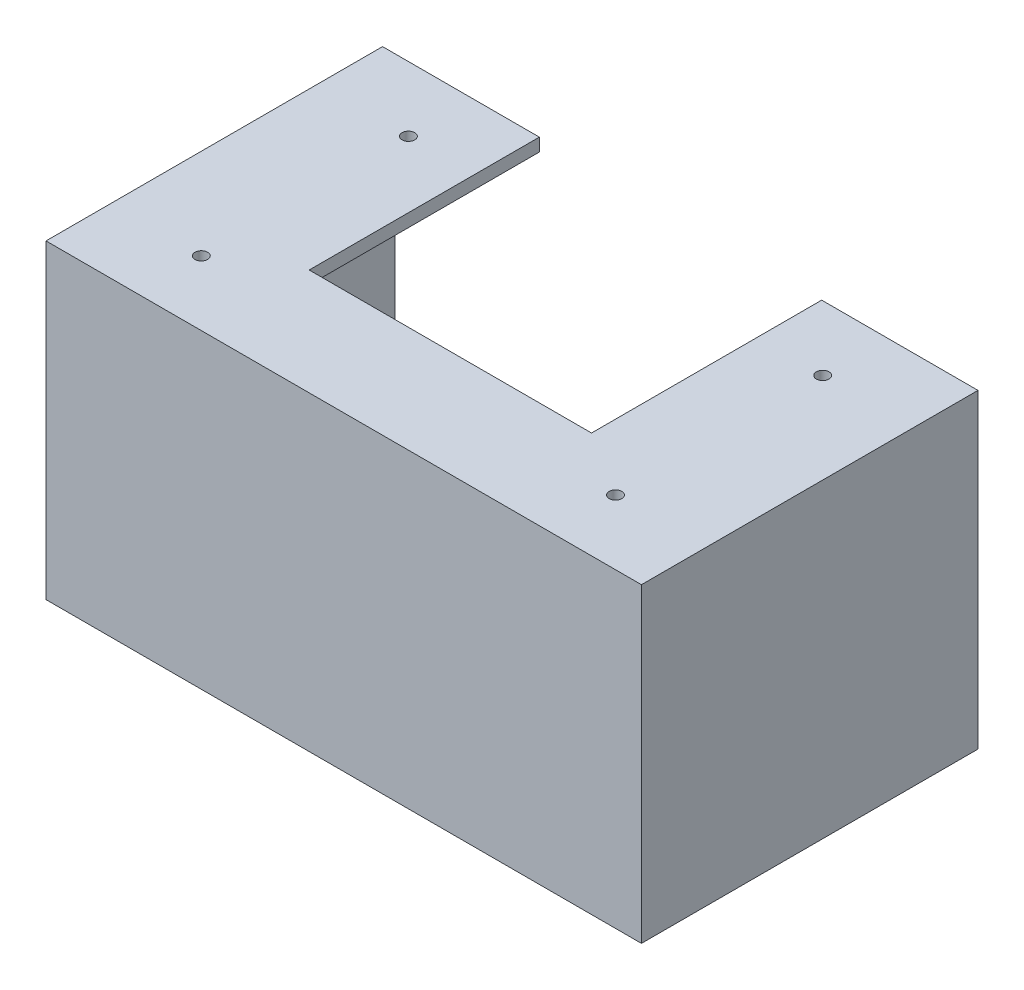
ISO-10303-21;
HEADER;
FILE_DESCRIPTION(('STEP AP214'),'2;1');
FILE_NAME('part.step','',(''),(''),'','','');
FILE_SCHEMA(('AUTOMOTIVE_DESIGN { 1 0 10303 214 1 1 1 1 }'));
ENDSEC;
DATA;
#1=APPLICATION_CONTEXT('core data for automotive mechanical design processes');
#2=APPLICATION_PROTOCOL_DEFINITION('international standard','automotive_design',2000,#1);
#3=PRODUCT_CONTEXT('',#1,'mechanical');
#4=PRODUCT('Part','Part','',(#3));
#5=PRODUCT_RELATED_PRODUCT_CATEGORY('part','',(#4));
#6=PRODUCT_DEFINITION_FORMATION('','',#4);
#7=PRODUCT_DEFINITION_CONTEXT('part definition',#1,'design');
#8=PRODUCT_DEFINITION('design','',#6,#7);
#9=PRODUCT_DEFINITION_SHAPE('','',#8);
#10=(LENGTH_UNIT() NAMED_UNIT(*) SI_UNIT(.MILLI.,.METRE.));
#11=(NAMED_UNIT(*) PLANE_ANGLE_UNIT() SI_UNIT($,.RADIAN.));
#12=(NAMED_UNIT(*) SI_UNIT($,.STERADIAN.) SOLID_ANGLE_UNIT());
#13=UNCERTAINTY_MEASURE_WITH_UNIT(LENGTH_MEASURE(1.E-05),#10,'distance_accuracy_value','');
#14=(GEOMETRIC_REPRESENTATION_CONTEXT(3) GLOBAL_UNCERTAINTY_ASSIGNED_CONTEXT((#13)) GLOBAL_UNIT_ASSIGNED_CONTEXT((#10,
#11,#12)) REPRESENTATION_CONTEXT('',''));
#15=CARTESIAN_POINT('',(0.,0.,0.));
#16=DIRECTION('',(0.,0.,1.));
#17=DIRECTION('',(1.,0.,0.));
#18=AXIS2_PLACEMENT_3D('',#15,#16,#17);
#19=CARTESIAN_POINT('',(0.,0.,0.));
#20=DIRECTION('',(0.,0.,1.));
#21=DIRECTION('',(1.,0.,0.));
#22=AXIS2_PLACEMENT_3D('',#19,#20,#21);
#23=PLANE('',#22);
#24=DIRECTION('',(-1.,0.,0.));
#25=VECTOR('',#24,1.);
#26=CARTESIAN_POINT('',(-3.02083002938287,3.175,0.));
#27=LINE('',#26,#25);
#28=CARTESIAN_POINT('',(35.4369689194814,3.175,0.));
#29=VERTEX_POINT('',#28);
#30=CARTESIAN_POINT('',(-3.02083002938287,3.175,0.));
#31=VERTEX_POINT('',#30);
#32=EDGE_CURVE('E258',#29,#31,#27,.T.);
#33=ORIENTED_EDGE('',*,*,#32,.F.);
#34=DIRECTION('',(0.,1.,0.));
#35=VECTOR('',#34,1.);
#36=CARTESIAN_POINT('',(35.4369689194814,-22.225,0.));
#37=LINE('',#36,#35);
#38=CARTESIAN_POINT('',(35.4369689194814,0.,0.));
#39=VERTEX_POINT('',#38);
#40=EDGE_CURVE('E149',#39,#29,#37,.T.);
#41=ORIENTED_EDGE('',*,*,#40,.F.);
#42=DIRECTION('',(-1.,0.,0.));
#43=VECTOR('',#42,1.);
#44=CARTESIAN_POINT('',(0.,0.,0.));
#45=LINE('',#44,#43);
#46=CARTESIAN_POINT('',(0.,0.,0.));
#47=VERTEX_POINT('',#46);
#48=EDGE_CURVE('E231',#39,#47,#45,.T.);
#49=ORIENTED_EDGE('',*,*,#48,.T.);
#50=DIRECTION('',(0.,-1.,0.));
#51=VECTOR('',#50,1.);
#52=CARTESIAN_POINT('',(0.,0.,0.));
#53=LINE('',#52,#51);
#54=CARTESIAN_POINT('',(0.,-69.85,0.));
#55=VERTEX_POINT('',#54);
#56=EDGE_CURVE('E203',#47,#55,#53,.T.);
#57=ORIENTED_EDGE('',*,*,#56,.T.);
#58=DIRECTION('',(1.,0.,0.));
#59=VECTOR('',#58,1.);
#60=CARTESIAN_POINT('',(0.,-69.85,0.));
#61=LINE('',#60,#59);
#62=CARTESIAN_POINT('',(139.7,-69.85,0.));
#63=VERTEX_POINT('',#62);
#64=EDGE_CURVE('E223',#55,#63,#61,.T.);
#65=ORIENTED_EDGE('',*,*,#64,.T.);
#66=DIRECTION('',(0.,1.,0.));
#67=VECTOR('',#66,1.);
#68=CARTESIAN_POINT('',(139.7,0.,0.));
#69=LINE('',#68,#67);
#70=CARTESIAN_POINT('',(139.7,0.,0.));
#71=VERTEX_POINT('',#70);
#72=EDGE_CURVE('E227',#63,#71,#69,.T.);
#73=ORIENTED_EDGE('',*,*,#72,.T.);
#74=CARTESIAN_POINT('',(104.688379126333,0.,0.));
#75=VERTEX_POINT('',#74);
#76=EDGE_CURVE('E209',#71,#75,#45,.T.);
#77=ORIENTED_EDGE('',*,*,#76,.T.);
#78=DIRECTION('',(0.,1.,0.));
#79=VECTOR('',#78,1.);
#80=CARTESIAN_POINT('',(104.688379126333,-22.225,0.));
#81=LINE('',#80,#79);
#82=CARTESIAN_POINT('',(104.688379126333,3.175,0.));
#83=VERTEX_POINT('',#82);
#84=EDGE_CURVE('E164',#75,#83,#81,.T.);
#85=ORIENTED_EDGE('',*,*,#84,.T.);
#86=CARTESIAN_POINT('',(143.029169970617,3.175,0.));
#87=VERTEX_POINT('',#86);
#88=EDGE_CURVE('E259',#87,#83,#27,.T.);
#89=ORIENTED_EDGE('',*,*,#88,.F.);
#90=DIRECTION('',(0.,1.,0.));
#91=VECTOR('',#90,1.);
#92=CARTESIAN_POINT('',(143.029169970617,3.175,0.));
#93=LINE('',#92,#91);
#94=CARTESIAN_POINT('',(143.029169970617,-73.025,0.));
#95=VERTEX_POINT('',#94);
#96=EDGE_CURVE('E255',#95,#87,#93,.T.);
#97=ORIENTED_EDGE('',*,*,#96,.F.);
#98=DIRECTION('',(1.,0.,0.));
#99=VECTOR('',#98,1.);
#100=CARTESIAN_POINT('',(-3.02083002938286,-73.025,0.));
#101=LINE('',#100,#99);
#102=CARTESIAN_POINT('',(-3.02083002938286,-73.025,0.));
#103=VERTEX_POINT('',#102);
#104=EDGE_CURVE('E252',#103,#95,#101,.T.);
#105=ORIENTED_EDGE('',*,*,#104,.F.);
#106=DIRECTION('',(0.,-1.,0.));
#107=VECTOR('',#106,1.);
#108=CARTESIAN_POINT('',(-3.02083002938287,3.175,0.));
#109=LINE('',#108,#107);
#110=EDGE_CURVE('E248',#31,#103,#109,.T.);
#111=ORIENTED_EDGE('',*,*,#110,.F.);
#112=EDGE_LOOP('',(#33,#41,#49,#57,#65,#73,#77,#85,#89,#97,#105,#111));
#113=FACE_BOUND('',#112,.T.);
#114=ADVANCED_FACE('F45',(#113),#23,.F.);
#115=CARTESIAN_POINT('',(-3.02083002938287,3.175,76.2));
#116=DIRECTION('',(1.,0.,0.));
#117=DIRECTION('',(0.,1.,0.));
#118=AXIS2_PLACEMENT_3D('',#115,#116,#117);
#119=PLANE('',#118);
#120=ORIENTED_EDGE('',*,*,#110,.T.);
#121=DIRECTION('',(0.,0.,-1.));
#122=VECTOR('',#121,1.);
#123=CARTESIAN_POINT('',(-3.02083002938286,-73.025,76.2));
#124=LINE('',#123,#122);
#125=CARTESIAN_POINT('',(-3.02083002938286,-73.025,82.55));
#126=VERTEX_POINT('',#125);
#127=EDGE_CURVE('E274',#126,#103,#124,.T.);
#128=ORIENTED_EDGE('',*,*,#127,.F.);
#129=DIRECTION('',(0.,-1.,0.));
#130=VECTOR('',#129,1.);
#131=CARTESIAN_POINT('',(-3.02083002938287,3.175,82.55));
#132=LINE('',#131,#130);
#133=CARTESIAN_POINT('',(-3.02083002938287,3.175,82.55));
#134=VERTEX_POINT('',#133);
#135=EDGE_CURVE('E186',#134,#126,#132,.T.);
#136=ORIENTED_EDGE('',*,*,#135,.F.);
#137=DIRECTION('',(0.,0.,-1.));
#138=VECTOR('',#137,1.);
#139=CARTESIAN_POINT('',(-3.02083002938287,3.175,76.2));
#140=LINE('',#139,#138);
#141=EDGE_CURVE('E262',#134,#31,#140,.T.);
#142=ORIENTED_EDGE('',*,*,#141,.T.);
#143=EDGE_LOOP('',(#120,#128,#136,#142));
#144=FACE_BOUND('',#143,.T.);
#145=ADVANCED_FACE('F47',(#144),#119,.F.);
#146=CARTESIAN_POINT('',(-3.02083002938286,-73.025,76.2));
#147=DIRECTION('',(0.,1.,0.));
#148=DIRECTION('',(0.,0.,1.));
#149=AXIS2_PLACEMENT_3D('',#146,#147,#148);
#150=PLANE('',#149);
#151=ORIENTED_EDGE('',*,*,#104,.T.);
#152=DIRECTION('',(0.,0.,-1.));
#153=VECTOR('',#152,1.);
#154=CARTESIAN_POINT('',(143.029169970617,-73.025,76.2));
#155=LINE('',#154,#153);
#156=CARTESIAN_POINT('',(143.029169970617,-73.025,82.55));
#157=VERTEX_POINT('',#156);
#158=EDGE_CURVE('E270',#157,#95,#155,.T.);
#159=ORIENTED_EDGE('',*,*,#158,.F.);
#160=DIRECTION('',(1.,0.,0.));
#161=VECTOR('',#160,1.);
#162=CARTESIAN_POINT('',(-3.02083002938286,-73.025,82.55));
#163=LINE('',#162,#161);
#164=EDGE_CURVE('E190',#126,#157,#163,.T.);
#165=ORIENTED_EDGE('',*,*,#164,.F.);
#166=ORIENTED_EDGE('',*,*,#127,.T.);
#167=EDGE_LOOP('',(#151,#159,#165,#166));
#168=FACE_BOUND('',#167,.T.);
#169=ADVANCED_FACE('F345',(#168),#150,.F.);
#170=CARTESIAN_POINT('',(143.029169970617,3.175,76.2));
#171=DIRECTION('',(-1.,0.,0.));
#172=DIRECTION('',(0.,0.,1.));
#173=AXIS2_PLACEMENT_3D('',#170,#171,#172);
#174=PLANE('',#173);
#175=ORIENTED_EDGE('',*,*,#96,.T.);
#176=DIRECTION('',(0.,0.,-1.));
#177=VECTOR('',#176,1.);
#178=CARTESIAN_POINT('',(143.029169970617,3.175,76.2));
#179=LINE('',#178,#177);
#180=CARTESIAN_POINT('',(143.029169970617,3.175,82.55));
#181=VERTEX_POINT('',#180);
#182=EDGE_CURVE('E266',#181,#87,#179,.T.);
#183=ORIENTED_EDGE('',*,*,#182,.F.);
#184=DIRECTION('',(0.,1.,0.));
#185=VECTOR('',#184,1.);
#186=CARTESIAN_POINT('',(143.029169970617,3.175,82.55));
#187=LINE('',#186,#185);
#188=EDGE_CURVE('E195',#157,#181,#187,.T.);
#189=ORIENTED_EDGE('',*,*,#188,.F.);
#190=ORIENTED_EDGE('',*,*,#158,.T.);
#191=EDGE_LOOP('',(#175,#183,#189,#190));
#192=FACE_BOUND('',#191,.T.);
#193=ADVANCED_FACE('F336',(#192),#174,.F.);
#194=CARTESIAN_POINT('',(-3.02083002938287,3.175,76.2));
#195=DIRECTION('',(0.,-1.,0.));
#196=DIRECTION('',(0.,0.,-1.));
#197=AXIS2_PLACEMENT_3D('',#194,#195,#196);
#198=PLANE('',#197);
#199=CARTESIAN_POINT('',(19.2041699706171,3.175,66.675));
#200=DIRECTION('',(0.,1.,0.));
#201=DIRECTION('',(0.,0.,1.));
#202=AXIS2_PLACEMENT_3D('',#199,#200,#201);
#203=CIRCLE('',#202,1.54999999999999);
#204=CARTESIAN_POINT('',(19.2041699706171,3.175,68.225));
#205=VERTEX_POINT('',#204);
#206=EDGE_CURVE('E163',#205,#205,#203,.T.);
#207=ORIENTED_EDGE('',*,*,#206,.F.);
#208=EDGE_LOOP('',(#207));
#209=FACE_BOUND('',#208,.T.);
#210=CARTESIAN_POINT('',(120.804169970617,3.175,66.675));
#211=DIRECTION('',(0.,1.,0.));
#212=DIRECTION('',(0.,0.,1.));
#213=AXIS2_PLACEMENT_3D('',#210,#211,#212);
#214=CIRCLE('',#213,1.54999999999999);
#215=CARTESIAN_POINT('',(120.804169970617,3.175,68.225));
#216=VERTEX_POINT('',#215);
#217=EDGE_CURVE('E175',#216,#216,#214,.T.);
#218=ORIENTED_EDGE('',*,*,#217,.F.);
#219=EDGE_LOOP('',(#218));
#220=FACE_BOUND('',#219,.T.);
#221=CARTESIAN_POINT('',(120.804169970617,3.175,15.875));
#222=DIRECTION('',(0.,1.,0.));
#223=DIRECTION('',(0.,0.,1.));
#224=AXIS2_PLACEMENT_3D('',#221,#222,#223);
#225=CIRCLE('',#224,1.54999999999999);
#226=CARTESIAN_POINT('',(120.804169970617,3.175,17.425));
#227=VERTEX_POINT('',#226);
#228=EDGE_CURVE('E170',#227,#227,#225,.T.);
#229=ORIENTED_EDGE('',*,*,#228,.F.);
#230=EDGE_LOOP('',(#229));
#231=FACE_BOUND('',#230,.T.);
#232=CARTESIAN_POINT('',(19.2041699706171,3.175,15.875));
#233=DIRECTION('',(0.,1.,0.));
#234=DIRECTION('',(0.,0.,1.));
#235=AXIS2_PLACEMENT_3D('',#232,#233,#234);
#236=CIRCLE('',#235,1.55);
#237=CARTESIAN_POINT('',(19.2041699706171,3.175,17.425));
#238=VERTEX_POINT('',#237);
#239=EDGE_CURVE('E174',#238,#238,#236,.T.);
#240=ORIENTED_EDGE('',*,*,#239,.F.);
#241=EDGE_LOOP('',(#240));
#242=FACE_BOUND('',#241,.T.);
#243=DIRECTION('',(1.,0.,0.));
#244=VECTOR('',#243,1.);
#245=CARTESIAN_POINT('',(35.4369689194814,3.175,56.452748130497));
#246=LINE('',#245,#244);
#247=CARTESIAN_POINT('',(35.4369689194814,3.175,56.452748130497));
#248=VERTEX_POINT('',#247);
#249=CARTESIAN_POINT('',(104.688379126333,3.175,56.452748130497));
#250=VERTEX_POINT('',#249);
#251=EDGE_CURVE('E136',#248,#250,#246,.T.);
#252=ORIENTED_EDGE('',*,*,#251,.F.);
#253=DIRECTION('',(0.,0.,1.));
#254=VECTOR('',#253,1.);
#255=CARTESIAN_POINT('',(35.4369689194814,3.175,0.));
#256=LINE('',#255,#254);
#257=EDGE_CURVE('E146',#29,#248,#256,.T.);
#258=ORIENTED_EDGE('',*,*,#257,.F.);
#259=ORIENTED_EDGE('',*,*,#32,.T.);
#260=ORIENTED_EDGE('',*,*,#141,.F.);
#261=DIRECTION('',(-1.,0.,0.));
#262=VECTOR('',#261,1.);
#263=CARTESIAN_POINT('',(-3.02083002938287,3.175,82.55));
#264=LINE('',#263,#262);
#265=EDGE_CURVE('E199',#181,#134,#264,.T.);
#266=ORIENTED_EDGE('',*,*,#265,.F.);
#267=ORIENTED_EDGE('',*,*,#182,.T.);
#268=ORIENTED_EDGE('',*,*,#88,.T.);
#269=DIRECTION('',(0.,0.,-1.));
#270=VECTOR('',#269,1.);
#271=CARTESIAN_POINT('',(104.688379126333,3.175,0.));
#272=LINE('',#271,#270);
#273=EDGE_CURVE('E143',#250,#83,#272,.T.);
#274=ORIENTED_EDGE('',*,*,#273,.F.);
#275=EDGE_LOOP('',(#252,#258,#259,#260,#266,#267,#268,#274));
#276=FACE_BOUND('',#275,.T.);
#277=ADVANCED_FACE('F154',(#209,#220,#231,#242,#276),#198,.F.);
#278=CARTESIAN_POINT('',(0.,0.,76.2));
#279=DIRECTION('',(1.,0.,0.));
#280=DIRECTION('',(0.,1.,0.));
#281=AXIS2_PLACEMENT_3D('',#278,#279,#280);
#282=PLANE('',#281);
#283=ORIENTED_EDGE('',*,*,#56,.F.);
#284=DIRECTION('',(0.,0.,-1.));
#285=VECTOR('',#284,1.);
#286=CARTESIAN_POINT('',(0.,0.,76.2));
#287=LINE('',#286,#285);
#288=CARTESIAN_POINT('',(0.,0.,76.2));
#289=VERTEX_POINT('',#288);
#290=EDGE_CURVE('E219',#289,#47,#287,.T.);
#291=ORIENTED_EDGE('',*,*,#290,.F.);
#292=DIRECTION('',(0.,-1.,0.));
#293=VECTOR('',#292,1.);
#294=CARTESIAN_POINT('',(0.,0.,76.2));
#295=LINE('',#294,#293);
#296=CARTESIAN_POINT('',(0.,-69.85,76.2));
#297=VERTEX_POINT('',#296);
#298=EDGE_CURVE('E204',#289,#297,#295,.T.);
#299=ORIENTED_EDGE('',*,*,#298,.T.);
#300=DIRECTION('',(0.,0.,-1.));
#301=VECTOR('',#300,1.);
#302=CARTESIAN_POINT('',(0.,-69.85,76.2));
#303=LINE('',#302,#301);
#304=EDGE_CURVE('E244',#297,#55,#303,.T.);
#305=ORIENTED_EDGE('',*,*,#304,.T.);
#306=EDGE_LOOP('',(#283,#291,#299,#305));
#307=FACE_BOUND('',#306,.T.);
#308=ADVANCED_FACE('F327',(#307),#282,.T.);
#309=CARTESIAN_POINT('',(0.,-69.85,76.2));
#310=DIRECTION('',(0.,1.,0.));
#311=DIRECTION('',(0.,0.,1.));
#312=AXIS2_PLACEMENT_3D('',#309,#310,#311);
#313=PLANE('',#312);
#314=ORIENTED_EDGE('',*,*,#64,.F.);
#315=ORIENTED_EDGE('',*,*,#304,.F.);
#316=DIRECTION('',(1.,0.,0.));
#317=VECTOR('',#316,1.);
#318=CARTESIAN_POINT('',(0.,-69.85,76.2));
#319=LINE('',#318,#317);
#320=CARTESIAN_POINT('',(139.7,-69.85,76.2));
#321=VERTEX_POINT('',#320);
#322=EDGE_CURVE('E208',#297,#321,#319,.T.);
#323=ORIENTED_EDGE('',*,*,#322,.T.);
#324=DIRECTION('',(0.,0.,-1.));
#325=VECTOR('',#324,1.);
#326=CARTESIAN_POINT('',(139.7,-69.85,76.2));
#327=LINE('',#326,#325);
#328=EDGE_CURVE('E241',#321,#63,#327,.T.);
#329=ORIENTED_EDGE('',*,*,#328,.T.);
#330=EDGE_LOOP('',(#314,#315,#323,#329));
#331=FACE_BOUND('',#330,.T.);
#332=ADVANCED_FACE('F325',(#331),#313,.T.);
#333=CARTESIAN_POINT('',(139.7,0.,76.2));
#334=DIRECTION('',(-1.,0.,0.));
#335=DIRECTION('',(0.,0.,1.));
#336=AXIS2_PLACEMENT_3D('',#333,#334,#335);
#337=PLANE('',#336);
#338=ORIENTED_EDGE('',*,*,#72,.F.);
#339=ORIENTED_EDGE('',*,*,#328,.F.);
#340=DIRECTION('',(0.,1.,0.));
#341=VECTOR('',#340,1.);
#342=CARTESIAN_POINT('',(139.7,0.,76.2));
#343=LINE('',#342,#341);
#344=CARTESIAN_POINT('',(139.7,0.,76.2));
#345=VERTEX_POINT('',#344);
#346=EDGE_CURVE('E213',#321,#345,#343,.T.);
#347=ORIENTED_EDGE('',*,*,#346,.T.);
#348=DIRECTION('',(0.,0.,-1.));
#349=VECTOR('',#348,1.);
#350=CARTESIAN_POINT('',(139.7,0.,76.2));
#351=LINE('',#350,#349);
#352=EDGE_CURVE('E238',#345,#71,#351,.T.);
#353=ORIENTED_EDGE('',*,*,#352,.T.);
#354=EDGE_LOOP('',(#338,#339,#347,#353));
#355=FACE_BOUND('',#354,.T.);
#356=ADVANCED_FACE('F321',(#355),#337,.T.);
#357=CARTESIAN_POINT('',(0.,0.,76.2));
#358=DIRECTION('',(0.,-1.,0.));
#359=DIRECTION('',(0.,0.,-1.));
#360=AXIS2_PLACEMENT_3D('',#357,#358,#359);
#361=PLANE('',#360);
#362=DIRECTION('',(0.,0.,-1.));
#363=VECTOR('',#362,1.);
#364=CARTESIAN_POINT('',(35.4369689194814,0.,76.2));
#365=LINE('',#364,#363);
#366=CARTESIAN_POINT('',(35.4369689194814,0.,56.452748130497));
#367=VERTEX_POINT('',#366);
#368=EDGE_CURVE('E11',#367,#39,#365,.T.);
#369=ORIENTED_EDGE('',*,*,#368,.F.);
#370=DIRECTION('',(-1.,0.,0.));
#371=VECTOR('',#370,1.);
#372=CARTESIAN_POINT('',(0.,0.,56.452748130497));
#373=LINE('',#372,#371);
#374=CARTESIAN_POINT('',(104.688379126333,0.,56.452748130497));
#375=VERTEX_POINT('',#374);
#376=EDGE_CURVE('E139',#375,#367,#373,.T.);
#377=ORIENTED_EDGE('',*,*,#376,.F.);
#378=DIRECTION('',(0.,0.,1.));
#379=VECTOR('',#378,1.);
#380=CARTESIAN_POINT('',(104.688379126333,0.,76.2));
#381=LINE('',#380,#379);
#382=EDGE_CURVE('E54',#75,#375,#381,.T.);
#383=ORIENTED_EDGE('',*,*,#382,.F.);
#384=ORIENTED_EDGE('',*,*,#76,.F.);
#385=ORIENTED_EDGE('',*,*,#352,.F.);
#386=DIRECTION('',(-1.,0.,0.));
#387=VECTOR('',#386,1.);
#388=CARTESIAN_POINT('',(0.,0.,76.2));
#389=LINE('',#388,#387);
#390=EDGE_CURVE('E69',#345,#289,#389,.T.);
#391=ORIENTED_EDGE('',*,*,#390,.T.);
#392=ORIENTED_EDGE('',*,*,#290,.T.);
#393=ORIENTED_EDGE('',*,*,#48,.F.);
#394=EDGE_LOOP('',(#369,#377,#383,#384,#385,#391,#392,#393));
#395=FACE_BOUND('',#394,.T.);
#396=CARTESIAN_POINT('',(19.2041699706171,0.,66.675));
#397=DIRECTION('',(0.,-1.,0.));
#398=DIRECTION('',(0.,0.,-1.));
#399=AXIS2_PLACEMENT_3D('',#396,#397,#398);
#400=CIRCLE('',#399,1.54999999999999);
#401=CARTESIAN_POINT('',(19.2041699706171,0.,65.125));
#402=VERTEX_POINT('',#401);
#403=EDGE_CURVE('E191',#402,#402,#400,.T.);
#404=ORIENTED_EDGE('',*,*,#403,.F.);
#405=EDGE_LOOP('',(#404));
#406=FACE_BOUND('',#405,.T.);
#407=CARTESIAN_POINT('',(120.804169970617,0.,66.675));
#408=DIRECTION('',(0.,-1.,0.));
#409=DIRECTION('',(0.,0.,-1.));
#410=AXIS2_PLACEMENT_3D('',#407,#408,#409);
#411=CIRCLE('',#410,1.54999999999999);
#412=CARTESIAN_POINT('',(120.804169970617,0.,65.125));
#413=VERTEX_POINT('',#412);
#414=EDGE_CURVE('E285',#413,#413,#411,.T.);
#415=ORIENTED_EDGE('',*,*,#414,.F.);
#416=EDGE_LOOP('',(#415));
#417=FACE_BOUND('',#416,.T.);
#418=CARTESIAN_POINT('',(120.804169970617,0.,15.875));
#419=DIRECTION('',(0.,-1.,0.));
#420=DIRECTION('',(0.,0.,-1.));
#421=AXIS2_PLACEMENT_3D('',#418,#419,#420);
#422=CIRCLE('',#421,1.54999999999999);
#423=CARTESIAN_POINT('',(120.804169970617,0.,14.325));
#424=VERTEX_POINT('',#423);
#425=EDGE_CURVE('E281',#424,#424,#422,.T.);
#426=ORIENTED_EDGE('',*,*,#425,.F.);
#427=EDGE_LOOP('',(#426));
#428=FACE_BOUND('',#427,.T.);
#429=CARTESIAN_POINT('',(19.2041699706171,0.,15.875));
#430=DIRECTION('',(0.,-1.,0.));
#431=DIRECTION('',(0.,0.,-1.));
#432=AXIS2_PLACEMENT_3D('',#429,#430,#431);
#433=CIRCLE('',#432,1.55);
#434=CARTESIAN_POINT('',(19.2041699706171,0.,14.325));
#435=VERTEX_POINT('',#434);
#436=EDGE_CURVE('E185',#435,#435,#433,.T.);
#437=ORIENTED_EDGE('',*,*,#436,.F.);
#438=EDGE_LOOP('',(#437));
#439=FACE_BOUND('',#438,.T.);
#440=ADVANCED_FACE('F299',(#395,#406,#417,#428,#439),#361,.T.);
#441=CARTESIAN_POINT('',(0.,0.,76.2));
#442=DIRECTION('',(0.,0.,1.));
#443=DIRECTION('',(1.,0.,0.));
#444=AXIS2_PLACEMENT_3D('',#441,#442,#443);
#445=PLANE('',#444);
#446=ORIENTED_EDGE('',*,*,#322,.F.);
#447=ORIENTED_EDGE('',*,*,#298,.F.);
#448=ORIENTED_EDGE('',*,*,#390,.F.);
#449=ORIENTED_EDGE('',*,*,#346,.F.);
#450=EDGE_LOOP('',(#446,#447,#448,#449));
#451=FACE_BOUND('',#450,.T.);
#452=ADVANCED_FACE('F322',(#451),#445,.F.);
#453=CARTESIAN_POINT('',(0.,0.,82.55));
#454=DIRECTION('',(0.,0.,1.));
#455=DIRECTION('',(1.,0.,0.));
#456=AXIS2_PLACEMENT_3D('',#453,#454,#455);
#457=PLANE('',#456);
#458=ORIENTED_EDGE('',*,*,#135,.T.);
#459=ORIENTED_EDGE('',*,*,#164,.T.);
#460=ORIENTED_EDGE('',*,*,#188,.T.);
#461=ORIENTED_EDGE('',*,*,#265,.T.);
#462=EDGE_LOOP('',(#458,#459,#460,#461));
#463=FACE_BOUND('',#462,.T.);
#464=ADVANCED_FACE('F312',(#463),#457,.T.);
#465=CARTESIAN_POINT('',(19.2041699706171,-3.175,15.875));
#466=DIRECTION('',(0.,1.,0.));
#467=DIRECTION('',(0.,0.,1.));
#468=AXIS2_PLACEMENT_3D('',#465,#466,#467);
#469=CYLINDRICAL_SURFACE('',#468,1.55);
#470=ORIENTED_EDGE('',*,*,#436,.T.);
#471=EDGE_LOOP('',(#470));
#472=FACE_BOUND('',#471,.T.);
#473=ORIENTED_EDGE('',*,*,#239,.T.);
#474=EDGE_LOOP('',(#473));
#475=FACE_BOUND('',#474,.T.);
#476=ADVANCED_FACE('F389',(#472,#475),#469,.F.);
#477=CARTESIAN_POINT('',(120.804169970617,-3.175,15.875));
#478=DIRECTION('',(0.,1.,0.));
#479=DIRECTION('',(0.,0.,1.));
#480=AXIS2_PLACEMENT_3D('',#477,#478,#479);
#481=CYLINDRICAL_SURFACE('',#480,1.54999999999999);
#482=ORIENTED_EDGE('',*,*,#425,.T.);
#483=EDGE_LOOP('',(#482));
#484=FACE_BOUND('',#483,.T.);
#485=ORIENTED_EDGE('',*,*,#228,.T.);
#486=EDGE_LOOP('',(#485));
#487=FACE_BOUND('',#486,.T.);
#488=ADVANCED_FACE('F398',(#484,#487),#481,.F.);
#489=CARTESIAN_POINT('',(120.804169970617,-3.175,66.675));
#490=DIRECTION('',(0.,1.,0.));
#491=DIRECTION('',(0.,0.,1.));
#492=AXIS2_PLACEMENT_3D('',#489,#490,#491);
#493=CYLINDRICAL_SURFACE('',#492,1.54999999999999);
#494=ORIENTED_EDGE('',*,*,#414,.T.);
#495=EDGE_LOOP('',(#494));
#496=FACE_BOUND('',#495,.T.);
#497=ORIENTED_EDGE('',*,*,#217,.T.);
#498=EDGE_LOOP('',(#497));
#499=FACE_BOUND('',#498,.T.);
#500=ADVANCED_FACE('F408',(#496,#499),#493,.F.);
#501=CARTESIAN_POINT('',(19.2041699706171,-3.175,66.675));
#502=DIRECTION('',(0.,1.,0.));
#503=DIRECTION('',(0.,0.,1.));
#504=AXIS2_PLACEMENT_3D('',#501,#502,#503);
#505=CYLINDRICAL_SURFACE('',#504,1.54999999999999);
#506=ORIENTED_EDGE('',*,*,#403,.T.);
#507=EDGE_LOOP('',(#506));
#508=FACE_BOUND('',#507,.T.);
#509=ORIENTED_EDGE('',*,*,#206,.T.);
#510=EDGE_LOOP('',(#509));
#511=FACE_BOUND('',#510,.T.);
#512=ADVANCED_FACE('F418',(#508,#511),#505,.F.);
#513=CARTESIAN_POINT('',(35.4369689194814,-22.225,0.));
#514=DIRECTION('',(-1.,0.,0.));
#515=DIRECTION('',(0.,0.,1.));
#516=AXIS2_PLACEMENT_3D('',#513,#514,#515);
#517=PLANE('',#516);
#518=ORIENTED_EDGE('',*,*,#368,.T.);
#519=ORIENTED_EDGE('',*,*,#40,.T.);
#520=ORIENTED_EDGE('',*,*,#257,.T.);
#521=DIRECTION('',(0.,1.,0.));
#522=VECTOR('',#521,1.);
#523=CARTESIAN_POINT('',(35.4369689194814,-22.225,56.452748130497));
#524=LINE('',#523,#522);
#525=EDGE_CURVE('E132',#367,#248,#524,.T.);
#526=ORIENTED_EDGE('',*,*,#525,.F.);
#527=EDGE_LOOP('',(#518,#519,#520,#526));
#528=FACE_BOUND('',#527,.T.);
#529=ADVANCED_FACE('F147',(#528),#517,.F.);
#530=CARTESIAN_POINT('',(104.688379126333,-22.225,0.));
#531=DIRECTION('',(1.,0.,0.));
#532=DIRECTION('',(0.,0.,-1.));
#533=AXIS2_PLACEMENT_3D('',#530,#531,#532);
#534=PLANE('',#533);
#535=ORIENTED_EDGE('',*,*,#382,.T.);
#536=DIRECTION('',(0.,1.,0.));
#537=VECTOR('',#536,1.);
#538=CARTESIAN_POINT('',(104.688379126333,-22.225,56.452748130497));
#539=LINE('',#538,#537);
#540=EDGE_CURVE('E61',#375,#250,#539,.T.);
#541=ORIENTED_EDGE('',*,*,#540,.T.);
#542=ORIENTED_EDGE('',*,*,#273,.T.);
#543=ORIENTED_EDGE('',*,*,#84,.F.);
#544=EDGE_LOOP('',(#535,#541,#542,#543));
#545=FACE_BOUND('',#544,.T.);
#546=ADVANCED_FACE('F296',(#545),#534,.F.);
#547=CARTESIAN_POINT('',(35.4369689194814,-22.225,56.452748130497));
#548=DIRECTION('',(0.,0.,1.));
#549=DIRECTION('',(1.,0.,0.));
#550=AXIS2_PLACEMENT_3D('',#547,#548,#549);
#551=PLANE('',#550);
#552=ORIENTED_EDGE('',*,*,#376,.T.);
#553=ORIENTED_EDGE('',*,*,#525,.T.);
#554=ORIENTED_EDGE('',*,*,#251,.T.);
#555=ORIENTED_EDGE('',*,*,#540,.F.);
#556=EDGE_LOOP('',(#552,#553,#554,#555));
#557=FACE_BOUND('',#556,.T.);
#558=ADVANCED_FACE('F134',(#557),#551,.F.);
#559=CLOSED_SHELL('',(#114,#145,#169,#193,#277,#308,#332,#356,#440,#452,#464,#476,#488,#500,
#512,#529,#546,#558));
#560=MANIFOLD_SOLID_BREP('B2',#559);
#561=ADVANCED_BREP_SHAPE_REPRESENTATION('',(#18,#560),#14);
#562=SHAPE_DEFINITION_REPRESENTATION(#9,#561);
ENDSEC;
END-ISO-10303-21;
